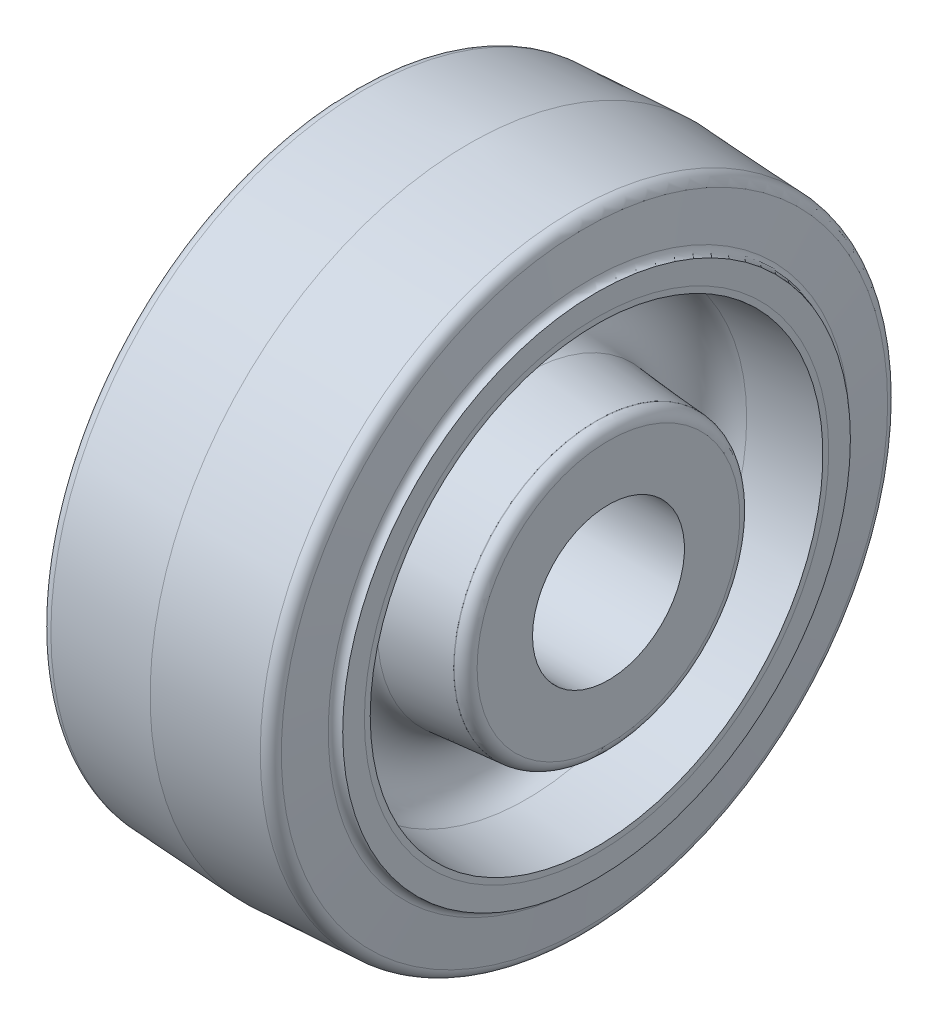
ISO-10303-21;
HEADER;
FILE_DESCRIPTION(('STEP AP214'),'2;1');
FILE_NAME('part.step','',(''),(''),'','','');
FILE_SCHEMA(('AUTOMOTIVE_DESIGN { 1 0 10303 214 1 1 1 1 }'));
ENDSEC;
DATA;
#1=APPLICATION_CONTEXT('core data for automotive mechanical design processes');
#2=APPLICATION_PROTOCOL_DEFINITION('international standard','automotive_design',2000,#1);
#3=PRODUCT_CONTEXT('',#1,'mechanical');
#4=PRODUCT('Part','Part','',(#3));
#5=PRODUCT_RELATED_PRODUCT_CATEGORY('part','',(#4));
#6=PRODUCT_DEFINITION_FORMATION('','',#4);
#7=PRODUCT_DEFINITION_CONTEXT('part definition',#1,'design');
#8=PRODUCT_DEFINITION('design','',#6,#7);
#9=PRODUCT_DEFINITION_SHAPE('','',#8);
#10=(LENGTH_UNIT() NAMED_UNIT(*) SI_UNIT(.MILLI.,.METRE.));
#11=(NAMED_UNIT(*) PLANE_ANGLE_UNIT() SI_UNIT($,.RADIAN.));
#12=(NAMED_UNIT(*) SI_UNIT($,.STERADIAN.) SOLID_ANGLE_UNIT());
#13=UNCERTAINTY_MEASURE_WITH_UNIT(LENGTH_MEASURE(1.E-05),#10,'distance_accuracy_value','');
#14=(GEOMETRIC_REPRESENTATION_CONTEXT(3) GLOBAL_UNCERTAINTY_ASSIGNED_CONTEXT((#13)) GLOBAL_UNIT_ASSIGNED_CONTEXT((#10,
#11,#12)) REPRESENTATION_CONTEXT('',''));
#15=CARTESIAN_POINT('',(0.,0.,0.));
#16=DIRECTION('',(0.,0.,1.));
#17=DIRECTION('',(1.,0.,0.));
#18=AXIS2_PLACEMENT_3D('',#15,#16,#17);
#19=CARTESIAN_POINT('',(-25.4889,0.,0.));
#20=DIRECTION('',(-1.,0.,0.));
#21=DIRECTION('',(0.,0.,1.));
#22=AXIS2_PLACEMENT_3D('',#19,#20,#21);
#23=TOROIDAL_SURFACE('',#22,26.162,2.286);
#24=CARTESIAN_POINT('',(-25.4889,0.,0.));
#25=DIRECTION('',(-1.,0.,0.));
#26=DIRECTION('',(0.,0.,1.));
#27=AXIS2_PLACEMENT_3D('',#24,#25,#26);
#28=CIRCLE('',#27,28.448);
#29=CARTESIAN_POINT('',(-25.4889,0.,28.448));
#30=VERTEX_POINT('',#29);
#31=EDGE_CURVE('E11',#30,#30,#28,.T.);
#32=ORIENTED_EDGE('',*,*,#31,.T.);
#33=EDGE_LOOP('',(#32));
#34=FACE_BOUND('',#33,.T.);
#35=CARTESIAN_POINT('',(-27.7749,0.,0.));
#36=DIRECTION('',(-1.,0.,0.));
#37=DIRECTION('',(0.,0.,1.));
#38=AXIS2_PLACEMENT_3D('',#35,#36,#37);
#39=CIRCLE('',#38,26.162);
#40=CARTESIAN_POINT('',(-27.7749,0.,26.162));
#41=VERTEX_POINT('',#40);
#42=EDGE_CURVE('E106',#41,#41,#39,.T.);
#43=ORIENTED_EDGE('',*,*,#42,.F.);
#44=EDGE_LOOP('',(#43));
#45=FACE_BOUND('',#44,.T.);
#46=ADVANCED_FACE('F36',(#34,#45),#23,.T.);
#47=CARTESIAN_POINT('',(27.7749,0.,0.));
#48=DIRECTION('',(-1.,0.,0.));
#49=DIRECTION('',(0.,0.,1.));
#50=AXIS2_PLACEMENT_3D('',#47,#48,#49);
#51=CYLINDRICAL_SURFACE('',#50,28.448);
#52=CARTESIAN_POINT('',(-25.4,0.,0.));
#53=DIRECTION('',(-1.,0.,0.));
#54=DIRECTION('',(0.,0.,1.));
#55=AXIS2_PLACEMENT_3D('',#52,#53,#54);
#56=CIRCLE('',#55,28.448);
#57=CARTESIAN_POINT('',(-25.4,0.,28.448));
#58=VERTEX_POINT('',#57);
#59=EDGE_CURVE('E42',#58,#58,#56,.T.);
#60=ORIENTED_EDGE('',*,*,#59,.T.);
#61=EDGE_LOOP('',(#60));
#62=FACE_BOUND('',#61,.T.);
#63=ORIENTED_EDGE('',*,*,#31,.F.);
#64=EDGE_LOOP('',(#63));
#65=FACE_BOUND('',#64,.T.);
#66=ADVANCED_FACE('F114',(#62,#65),#51,.T.);
#67=CARTESIAN_POINT('',(-25.4,28.448,0.));
#68=DIRECTION('',(-1.,0.,0.));
#69=DIRECTION('',(0.,0.,1.));
#70=AXIS2_PLACEMENT_3D('',#67,#68,#69);
#71=PLANE('',#70);
#72=CARTESIAN_POINT('',(-25.4,0.,0.));
#73=DIRECTION('',(-1.,0.,0.));
#74=DIRECTION('',(0.,0.,1.));
#75=AXIS2_PLACEMENT_3D('',#72,#73,#74);
#76=CIRCLE('',#75,28.4557777421875);
#77=CARTESIAN_POINT('',(-25.4,0.,28.4557777421875));
#78=VERTEX_POINT('',#77);
#79=EDGE_CURVE('E46',#78,#78,#76,.T.);
#80=ORIENTED_EDGE('',*,*,#79,.T.);
#81=EDGE_LOOP('',(#80));
#82=FACE_BOUND('',#81,.T.);
#83=ORIENTED_EDGE('',*,*,#59,.F.);
#84=EDGE_LOOP('',(#83));
#85=FACE_BOUND('',#84,.T.);
#86=ADVANCED_FACE('F118',(#82,#85),#71,.T.);
#87=CARTESIAN_POINT('',(-25.4,0.,0.));
#88=DIRECTION('',(1.,0.,0.));
#89=DIRECTION('',(0.,0.,-1.));
#90=AXIS2_PLACEMENT_3D('',#87,#88,#89);
#91=CONICAL_SURFACE('',#90,28.4557777421875,0.0872664625997167);
#92=CARTESIAN_POINT('',(-11.4451483575787,0.,0.));
#93=DIRECTION('',(-1.,0.,0.));
#94=DIRECTION('',(0.,0.,1.));
#95=AXIS2_PLACEMENT_3D('',#92,#93,#94);
#96=CIRCLE('',#95,29.6766690620855);
#97=CARTESIAN_POINT('',(-11.4451483575787,0.,29.6766690620855));
#98=VERTEX_POINT('',#97);
#99=EDGE_CURVE('E50',#98,#98,#96,.T.);
#100=ORIENTED_EDGE('',*,*,#99,.T.);
#101=EDGE_LOOP('',(#100));
#102=FACE_BOUND('',#101,.T.);
#103=ORIENTED_EDGE('',*,*,#79,.F.);
#104=EDGE_LOOP('',(#103));
#105=FACE_BOUND('',#104,.T.);
#106=ADVANCED_FACE('F122',(#102,#105),#91,.T.);
#107=CARTESIAN_POINT('',(-12.065,0.,0.));
#108=DIRECTION('',(-1.,0.,0.));
#109=DIRECTION('',(0.,0.,1.));
#110=AXIS2_PLACEMENT_3D('',#107,#108,#109);
#111=TOROIDAL_SURFACE('',#110,36.7616057549139,7.112);
#112=CARTESIAN_POINT('',(-11.4451483575787,0.,0.));
#113=DIRECTION('',(-1.,0.,0.));
#114=DIRECTION('',(0.,0.,1.));
#115=AXIS2_PLACEMENT_3D('',#112,#113,#114);
#116=CIRCLE('',#115,43.8465424477424);
#117=CARTESIAN_POINT('',(-11.4451483575787,0.,43.8465424477424));
#118=VERTEX_POINT('',#117);
#119=EDGE_CURVE('E55',#118,#118,#116,.T.);
#120=ORIENTED_EDGE('',*,*,#119,.T.);
#121=EDGE_LOOP('',(#120));
#122=FACE_BOUND('',#121,.T.);
#123=ORIENTED_EDGE('',*,*,#99,.F.);
#124=EDGE_LOOP('',(#123));
#125=FACE_BOUND('',#124,.T.);
#126=ADVANCED_FACE('F129',(#122,#125),#111,.F.);
#127=CARTESIAN_POINT('',(-11.4451483575787,0.,0.));
#128=DIRECTION('',(-1.,0.,0.));
#129=DIRECTION('',(0.,0.,1.));
#130=AXIS2_PLACEMENT_3D('',#127,#128,#129);
#131=CONICAL_SURFACE('',#130,43.8465424477424,0.0872664625997172);
#132=CARTESIAN_POINT('',(-25.4,0.,0.));
#133=DIRECTION('',(-1.,0.,0.));
#134=DIRECTION('',(0.,0.,1.));
#135=AXIS2_PLACEMENT_3D('',#132,#133,#134);
#136=CIRCLE('',#135,45.0674337676404);
#137=CARTESIAN_POINT('',(-25.4,0.,45.0674337676404));
#138=VERTEX_POINT('',#137);
#139=EDGE_CURVE('E58',#138,#138,#136,.T.);
#140=ORIENTED_EDGE('',*,*,#139,.T.);
#141=EDGE_LOOP('',(#140));
#142=FACE_BOUND('',#141,.T.);
#143=ORIENTED_EDGE('',*,*,#119,.F.);
#144=EDGE_LOOP('',(#143));
#145=FACE_BOUND('',#144,.T.);
#146=ADVANCED_FACE('F133',(#142,#145),#131,.F.);
#147=CARTESIAN_POINT('',(-25.4,45.0674337676404,0.));
#148=DIRECTION('',(-1.,0.,0.));
#149=DIRECTION('',(0.,0.,1.));
#150=AXIS2_PLACEMENT_3D('',#147,#148,#149);
#151=PLANE('',#150);
#152=CARTESIAN_POINT('',(-25.4,0.,0.));
#153=DIRECTION('',(-1.,0.,0.));
#154=DIRECTION('',(0.,0.,1.));
#155=AXIS2_PLACEMENT_3D('',#152,#153,#154);
#156=CIRCLE('',#155,46.228);
#157=CARTESIAN_POINT('',(-25.4,0.,46.228));
#158=VERTEX_POINT('',#157);
#159=EDGE_CURVE('E61',#158,#158,#156,.T.);
#160=ORIENTED_EDGE('',*,*,#159,.T.);
#161=EDGE_LOOP('',(#160));
#162=FACE_BOUND('',#161,.T.);
#163=ORIENTED_EDGE('',*,*,#139,.F.);
#164=EDGE_LOOP('',(#163));
#165=FACE_BOUND('',#164,.T.);
#166=ADVANCED_FACE('F137',(#162,#165),#151,.T.);
#167=CARTESIAN_POINT('',(27.7749,0.,0.));
#168=DIRECTION('',(-1.,0.,0.));
#169=DIRECTION('',(0.,0.,1.));
#170=AXIS2_PLACEMENT_3D('',#167,#168,#169);
#171=CYLINDRICAL_SURFACE('',#170,46.228);
#172=CARTESIAN_POINT('',(-19.05,0.,0.));
#173=DIRECTION('',(-1.,0.,0.));
#174=DIRECTION('',(0.,0.,1.));
#175=AXIS2_PLACEMENT_3D('',#172,#173,#174);
#176=CIRCLE('',#175,46.228);
#177=CARTESIAN_POINT('',(-19.05,0.,46.228));
#178=VERTEX_POINT('',#177);
#179=EDGE_CURVE('E64',#178,#178,#176,.T.);
#180=ORIENTED_EDGE('',*,*,#179,.T.);
#181=EDGE_LOOP('',(#180));
#182=FACE_BOUND('',#181,.T.);
#183=ORIENTED_EDGE('',*,*,#159,.F.);
#184=EDGE_LOOP('',(#183));
#185=FACE_BOUND('',#184,.T.);
#186=ADVANCED_FACE('F141',(#182,#185),#171,.T.);
#187=CARTESIAN_POINT('',(-19.05,46.228,0.));
#188=DIRECTION('',(-1.,0.,0.));
#189=DIRECTION('',(0.,0.,1.));
#190=AXIS2_PLACEMENT_3D('',#187,#188,#189);
#191=PLANE('',#190);
#192=CARTESIAN_POINT('',(-19.05,0.,0.));
#193=DIRECTION('',(-1.,0.,0.));
#194=DIRECTION('',(0.,0.,1.));
#195=AXIS2_PLACEMENT_3D('',#192,#193,#194);
#196=CIRCLE('',#195,53.848);
#197=CARTESIAN_POINT('',(-19.05,0.,53.848));
#198=VERTEX_POINT('',#197);
#199=EDGE_CURVE('E67',#198,#198,#196,.T.);
#200=ORIENTED_EDGE('',*,*,#199,.T.);
#201=EDGE_LOOP('',(#200));
#202=FACE_BOUND('',#201,.T.);
#203=ORIENTED_EDGE('',*,*,#179,.F.);
#204=EDGE_LOOP('',(#203));
#205=FACE_BOUND('',#204,.T.);
#206=ADVANCED_FACE('F145',(#202,#205),#191,.T.);
#207=CARTESIAN_POINT('',(27.7749,0.,0.));
#208=DIRECTION('',(-1.,0.,0.));
#209=DIRECTION('',(0.,0.,1.));
#210=AXIS2_PLACEMENT_3D('',#207,#208,#209);
#211=CYLINDRICAL_SURFACE('',#210,53.848);
#212=CARTESIAN_POINT('',(19.05,0.,0.));
#213=DIRECTION('',(-1.,0.,0.));
#214=DIRECTION('',(0.,0.,1.));
#215=AXIS2_PLACEMENT_3D('',#212,#213,#214);
#216=CIRCLE('',#215,53.848);
#217=CARTESIAN_POINT('',(19.05,0.,53.848));
#218=VERTEX_POINT('',#217);
#219=EDGE_CURVE('E70',#218,#218,#216,.T.);
#220=ORIENTED_EDGE('',*,*,#219,.T.);
#221=EDGE_LOOP('',(#220));
#222=FACE_BOUND('',#221,.T.);
#223=ORIENTED_EDGE('',*,*,#199,.F.);
#224=EDGE_LOOP('',(#223));
#225=FACE_BOUND('',#224,.T.);
#226=ADVANCED_FACE('F149',(#222,#225),#211,.T.);
#227=CARTESIAN_POINT('',(19.05,53.848,0.));
#228=DIRECTION('',(1.,0.,0.));
#229=DIRECTION('',(0.,0.,-1.));
#230=AXIS2_PLACEMENT_3D('',#227,#228,#229);
#231=PLANE('',#230);
#232=CARTESIAN_POINT('',(19.05,0.,0.));
#233=DIRECTION('',(-1.,0.,0.));
#234=DIRECTION('',(0.,0.,1.));
#235=AXIS2_PLACEMENT_3D('',#232,#233,#234);
#236=CIRCLE('',#235,46.228);
#237=CARTESIAN_POINT('',(19.05,0.,46.228));
#238=VERTEX_POINT('',#237);
#239=EDGE_CURVE('E73',#238,#238,#236,.T.);
#240=ORIENTED_EDGE('',*,*,#239,.T.);
#241=EDGE_LOOP('',(#240));
#242=FACE_BOUND('',#241,.T.);
#243=ORIENTED_EDGE('',*,*,#219,.F.);
#244=EDGE_LOOP('',(#243));
#245=FACE_BOUND('',#244,.T.);
#246=ADVANCED_FACE('F153',(#242,#245),#231,.T.);
#247=CARTESIAN_POINT('',(27.7749,0.,0.));
#248=DIRECTION('',(-1.,0.,0.));
#249=DIRECTION('',(0.,0.,1.));
#250=AXIS2_PLACEMENT_3D('',#247,#248,#249);
#251=CYLINDRICAL_SURFACE('',#250,46.228);
#252=CARTESIAN_POINT('',(25.4,0.,0.));
#253=DIRECTION('',(-1.,0.,0.));
#254=DIRECTION('',(0.,0.,1.));
#255=AXIS2_PLACEMENT_3D('',#252,#253,#254);
#256=CIRCLE('',#255,46.228);
#257=CARTESIAN_POINT('',(25.4,0.,46.228));
#258=VERTEX_POINT('',#257);
#259=EDGE_CURVE('E76',#258,#258,#256,.T.);
#260=ORIENTED_EDGE('',*,*,#259,.T.);
#261=EDGE_LOOP('',(#260));
#262=FACE_BOUND('',#261,.T.);
#263=ORIENTED_EDGE('',*,*,#239,.F.);
#264=EDGE_LOOP('',(#263));
#265=FACE_BOUND('',#264,.T.);
#266=ADVANCED_FACE('F157',(#262,#265),#251,.T.);
#267=CARTESIAN_POINT('',(25.4,46.228,0.));
#268=DIRECTION('',(1.,0.,0.));
#269=DIRECTION('',(0.,0.,-1.));
#270=AXIS2_PLACEMENT_3D('',#267,#268,#269);
#271=PLANE('',#270);
#272=CARTESIAN_POINT('',(25.4,0.,0.));
#273=DIRECTION('',(-1.,0.,0.));
#274=DIRECTION('',(0.,0.,1.));
#275=AXIS2_PLACEMENT_3D('',#272,#273,#274);
#276=CIRCLE('',#275,45.0674337676404);
#277=CARTESIAN_POINT('',(25.4,0.,45.0674337676404));
#278=VERTEX_POINT('',#277);
#279=EDGE_CURVE('E79',#278,#278,#276,.T.);
#280=ORIENTED_EDGE('',*,*,#279,.T.);
#281=EDGE_LOOP('',(#280));
#282=FACE_BOUND('',#281,.T.);
#283=ORIENTED_EDGE('',*,*,#259,.F.);
#284=EDGE_LOOP('',(#283));
#285=FACE_BOUND('',#284,.T.);
#286=ADVANCED_FACE('F161',(#282,#285),#271,.T.);
#287=CARTESIAN_POINT('',(25.4,0.,0.));
#288=DIRECTION('',(1.,0.,0.));
#289=DIRECTION('',(0.,0.,-1.));
#290=AXIS2_PLACEMENT_3D('',#287,#288,#289);
#291=CONICAL_SURFACE('',#290,45.0674337676404,0.0872664625997172);
#292=CARTESIAN_POINT('',(11.4451483575787,0.,0.));
#293=DIRECTION('',(-1.,0.,0.));
#294=DIRECTION('',(0.,0.,1.));
#295=AXIS2_PLACEMENT_3D('',#292,#293,#294);
#296=CIRCLE('',#295,43.8465424477424);
#297=CARTESIAN_POINT('',(11.4451483575787,0.,43.8465424477424));
#298=VERTEX_POINT('',#297);
#299=EDGE_CURVE('E82',#298,#298,#296,.T.);
#300=ORIENTED_EDGE('',*,*,#299,.T.);
#301=EDGE_LOOP('',(#300));
#302=FACE_BOUND('',#301,.T.);
#303=ORIENTED_EDGE('',*,*,#279,.F.);
#304=EDGE_LOOP('',(#303));
#305=FACE_BOUND('',#304,.T.);
#306=ADVANCED_FACE('F165',(#302,#305),#291,.F.);
#307=CARTESIAN_POINT('',(12.065,0.,0.));
#308=DIRECTION('',(-1.,0.,0.));
#309=DIRECTION('',(0.,0.,1.));
#310=AXIS2_PLACEMENT_3D('',#307,#308,#309);
#311=TOROIDAL_SURFACE('',#310,36.7616057549139,7.112);
#312=CARTESIAN_POINT('',(11.4451483575787,0.,0.));
#313=DIRECTION('',(-1.,0.,0.));
#314=DIRECTION('',(0.,0.,1.));
#315=AXIS2_PLACEMENT_3D('',#312,#313,#314);
#316=CIRCLE('',#315,29.6766690620855);
#317=CARTESIAN_POINT('',(11.4451483575787,0.,29.6766690620855));
#318=VERTEX_POINT('',#317);
#319=EDGE_CURVE('E85',#318,#318,#316,.T.);
#320=ORIENTED_EDGE('',*,*,#319,.T.);
#321=EDGE_LOOP('',(#320));
#322=FACE_BOUND('',#321,.T.);
#323=ORIENTED_EDGE('',*,*,#299,.F.);
#324=EDGE_LOOP('',(#323));
#325=FACE_BOUND('',#324,.T.);
#326=ADVANCED_FACE('F169',(#322,#325),#311,.F.);
#327=CARTESIAN_POINT('',(11.4451483575787,0.,0.));
#328=DIRECTION('',(-1.,0.,0.));
#329=DIRECTION('',(0.,0.,1.));
#330=AXIS2_PLACEMENT_3D('',#327,#328,#329);
#331=CONICAL_SURFACE('',#330,29.6766690620855,0.0872664625997167);
#332=CARTESIAN_POINT('',(25.4,0.,0.));
#333=DIRECTION('',(-1.,0.,0.));
#334=DIRECTION('',(0.,0.,1.));
#335=AXIS2_PLACEMENT_3D('',#332,#333,#334);
#336=CIRCLE('',#335,28.4557777421875);
#337=CARTESIAN_POINT('',(25.4,0.,28.4557777421875));
#338=VERTEX_POINT('',#337);
#339=EDGE_CURVE('E88',#338,#338,#336,.T.);
#340=ORIENTED_EDGE('',*,*,#339,.T.);
#341=EDGE_LOOP('',(#340));
#342=FACE_BOUND('',#341,.T.);
#343=ORIENTED_EDGE('',*,*,#319,.F.);
#344=EDGE_LOOP('',(#343));
#345=FACE_BOUND('',#344,.T.);
#346=ADVANCED_FACE('F173',(#342,#345),#331,.T.);
#347=CARTESIAN_POINT('',(25.4,28.4557777421875,0.));
#348=DIRECTION('',(1.,0.,0.));
#349=DIRECTION('',(0.,0.,-1.));
#350=AXIS2_PLACEMENT_3D('',#347,#348,#349);
#351=PLANE('',#350);
#352=CARTESIAN_POINT('',(25.4,0.,0.));
#353=DIRECTION('',(-1.,0.,0.));
#354=DIRECTION('',(0.,0.,1.));
#355=AXIS2_PLACEMENT_3D('',#352,#353,#354);
#356=CIRCLE('',#355,28.448);
#357=CARTESIAN_POINT('',(25.4,0.,28.448));
#358=VERTEX_POINT('',#357);
#359=EDGE_CURVE('E91',#358,#358,#356,.T.);
#360=ORIENTED_EDGE('',*,*,#359,.T.);
#361=EDGE_LOOP('',(#360));
#362=FACE_BOUND('',#361,.T.);
#363=ORIENTED_EDGE('',*,*,#339,.F.);
#364=EDGE_LOOP('',(#363));
#365=FACE_BOUND('',#364,.T.);
#366=ADVANCED_FACE('F177',(#362,#365),#351,.T.);
#367=CARTESIAN_POINT('',(27.7749,0.,0.));
#368=DIRECTION('',(-1.,0.,0.));
#369=DIRECTION('',(0.,0.,1.));
#370=AXIS2_PLACEMENT_3D('',#367,#368,#369);
#371=CYLINDRICAL_SURFACE('',#370,28.448);
#372=CARTESIAN_POINT('',(25.4889,0.,0.));
#373=DIRECTION('',(-1.,0.,0.));
#374=DIRECTION('',(0.,0.,1.));
#375=AXIS2_PLACEMENT_3D('',#372,#373,#374);
#376=CIRCLE('',#375,28.448);
#377=CARTESIAN_POINT('',(25.4889,0.,28.448));
#378=VERTEX_POINT('',#377);
#379=EDGE_CURVE('E94',#378,#378,#376,.T.);
#380=ORIENTED_EDGE('',*,*,#379,.T.);
#381=EDGE_LOOP('',(#380));
#382=FACE_BOUND('',#381,.T.);
#383=ORIENTED_EDGE('',*,*,#359,.F.);
#384=EDGE_LOOP('',(#383));
#385=FACE_BOUND('',#384,.T.);
#386=ADVANCED_FACE('F181',(#382,#385),#371,.T.);
#387=CARTESIAN_POINT('',(25.4889,0.,0.));
#388=DIRECTION('',(-1.,0.,0.));
#389=DIRECTION('',(0.,0.,1.));
#390=AXIS2_PLACEMENT_3D('',#387,#388,#389);
#391=TOROIDAL_SURFACE('',#390,26.162,2.286);
#392=CARTESIAN_POINT('',(27.7749,0.,0.));
#393=DIRECTION('',(-1.,0.,0.));
#394=DIRECTION('',(0.,0.,1.));
#395=AXIS2_PLACEMENT_3D('',#392,#393,#394);
#396=CIRCLE('',#395,26.162);
#397=CARTESIAN_POINT('',(27.7749,0.,26.162));
#398=VERTEX_POINT('',#397);
#399=EDGE_CURVE('E97',#398,#398,#396,.T.);
#400=ORIENTED_EDGE('',*,*,#399,.T.);
#401=EDGE_LOOP('',(#400));
#402=FACE_BOUND('',#401,.T.);
#403=ORIENTED_EDGE('',*,*,#379,.F.);
#404=EDGE_LOOP('',(#403));
#405=FACE_BOUND('',#404,.T.);
#406=ADVANCED_FACE('F185',(#402,#405),#391,.T.);
#407=CARTESIAN_POINT('',(27.7749,26.162,0.));
#408=DIRECTION('',(1.,0.,0.));
#409=DIRECTION('',(0.,0.,-1.));
#410=AXIS2_PLACEMENT_3D('',#407,#408,#409);
#411=PLANE('',#410);
#412=CARTESIAN_POINT('',(27.7749,0.,0.));
#413=DIRECTION('',(-1.,0.,0.));
#414=DIRECTION('',(0.,0.,1.));
#415=AXIS2_PLACEMENT_3D('',#412,#413,#414);
#416=CIRCLE('',#415,15.1257);
#417=CARTESIAN_POINT('',(27.7749,0.,15.1257));
#418=VERTEX_POINT('',#417);
#419=EDGE_CURVE('E100',#418,#418,#416,.T.);
#420=ORIENTED_EDGE('',*,*,#419,.T.);
#421=EDGE_LOOP('',(#420));
#422=FACE_BOUND('',#421,.T.);
#423=ORIENTED_EDGE('',*,*,#399,.F.);
#424=EDGE_LOOP('',(#423));
#425=FACE_BOUND('',#424,.T.);
#426=ADVANCED_FACE('F189',(#422,#425),#411,.T.);
#427=CARTESIAN_POINT('',(27.7749,0.,0.));
#428=DIRECTION('',(-1.,0.,0.));
#429=DIRECTION('',(0.,0.,1.));
#430=AXIS2_PLACEMENT_3D('',#427,#428,#429);
#431=CYLINDRICAL_SURFACE('',#430,15.1257);
#432=CARTESIAN_POINT('',(-27.7749,0.,0.));
#433=DIRECTION('',(-1.,0.,0.));
#434=DIRECTION('',(0.,0.,1.));
#435=AXIS2_PLACEMENT_3D('',#432,#433,#434);
#436=CIRCLE('',#435,15.1257);
#437=CARTESIAN_POINT('',(-27.7749,0.,15.1257));
#438=VERTEX_POINT('',#437);
#439=EDGE_CURVE('E103',#438,#438,#436,.T.);
#440=ORIENTED_EDGE('',*,*,#439,.T.);
#441=EDGE_LOOP('',(#440));
#442=FACE_BOUND('',#441,.T.);
#443=ORIENTED_EDGE('',*,*,#419,.F.);
#444=EDGE_LOOP('',(#443));
#445=FACE_BOUND('',#444,.T.);
#446=ADVANCED_FACE('F193',(#442,#445),#431,.F.);
#447=CARTESIAN_POINT('',(-27.7749,15.1257,0.));
#448=DIRECTION('',(-1.,0.,0.));
#449=DIRECTION('',(0.,0.,1.));
#450=AXIS2_PLACEMENT_3D('',#447,#448,#449);
#451=PLANE('',#450);
#452=ORIENTED_EDGE('',*,*,#42,.T.);
#453=EDGE_LOOP('',(#452));
#454=FACE_BOUND('',#453,.T.);
#455=ORIENTED_EDGE('',*,*,#439,.F.);
#456=EDGE_LOOP('',(#455));
#457=FACE_BOUND('',#456,.T.);
#458=ADVANCED_FACE('F110',(#454,#457),#451,.T.);
#459=CLOSED_SHELL('',(#46,#66,#86,#106,#126,#146,#166,#186,#206,#226,#246,#266,#286,#306,#326,
#346,#366,#386,#406,#426,#446,#458));
#460=MANIFOLD_SOLID_BREP('B2',#459);
#461=CARTESIAN_POINT('',(25.4,0.,0.));
#462=DIRECTION('',(1.,0.,0.));
#463=DIRECTION('',(0.,0.,-1.));
#464=AXIS2_PLACEMENT_3D('',#461,#462,#463);
#465=TOROIDAL_SURFACE('',#464,52.07,1.524);
#466=CARTESIAN_POINT('',(23.8843486314587,0.,0.));
#467=DIRECTION('',(1.,0.,0.));
#468=DIRECTION('',(0.,0.,-1.));
#469=AXIS2_PLACEMENT_3D('',#466,#467,#468);
#470=CIRCLE('',#469,51.9106986219801);
#471=CARTESIAN_POINT('',(23.8843486314587,0.,-51.9106986219801));
#472=VERTEX_POINT('',#471);
#473=EDGE_CURVE('E416',#472,#472,#470,.T.);
#474=ORIENTED_EDGE('',*,*,#473,.T.);
#475=EDGE_LOOP('',(#474));
#476=FACE_BOUND('',#475,.T.);
#477=CARTESIAN_POINT('',(25.4,0.,0.));
#478=DIRECTION('',(1.,0.,0.));
#479=DIRECTION('',(0.,0.,-1.));
#480=AXIS2_PLACEMENT_3D('',#477,#478,#479);
#481=CIRCLE('',#480,50.546);
#482=CARTESIAN_POINT('',(25.4,0.,-50.546));
#483=VERTEX_POINT('',#482);
#484=EDGE_CURVE('E35',#483,#483,#481,.T.);
#485=ORIENTED_EDGE('',*,*,#484,.F.);
#486=EDGE_LOOP('',(#485));
#487=FACE_BOUND('',#486,.T.);
#488=ADVANCED_FACE('F367',(#476,#487),#465,.F.);
#489=CARTESIAN_POINT('',(25.4,46.228,0.));
#490=DIRECTION('',(1.,0.,0.));
#491=DIRECTION('',(0.,0.,-1.));
#492=AXIS2_PLACEMENT_3D('',#489,#490,#491);
#493=PLANE('',#492);
#494=ORIENTED_EDGE('',*,*,#484,.T.);
#495=EDGE_LOOP('',(#494));
#496=FACE_BOUND('',#495,.T.);
#497=CARTESIAN_POINT('',(25.4,0.,0.));
#498=DIRECTION('',(1.,0.,0.));
#499=DIRECTION('',(0.,0.,-1.));
#500=AXIS2_PLACEMENT_3D('',#497,#498,#499);
#501=CIRCLE('',#500,46.228);
#502=CARTESIAN_POINT('',(25.4,0.,-46.228));
#503=VERTEX_POINT('',#502);
#504=EDGE_CURVE('E373',#503,#503,#501,.T.);
#505=ORIENTED_EDGE('',*,*,#504,.F.);
#506=EDGE_LOOP('',(#505));
#507=FACE_BOUND('',#506,.T.);
#508=ADVANCED_FACE('F434',(#496,#507),#493,.T.);
#509=CARTESIAN_POINT('',(-25.4,0.,0.));
#510=DIRECTION('',(1.,0.,0.));
#511=DIRECTION('',(0.,0.,-1.));
#512=AXIS2_PLACEMENT_3D('',#509,#510,#511);
#513=CYLINDRICAL_SURFACE('',#512,46.228);
#514=ORIENTED_EDGE('',*,*,#504,.T.);
#515=EDGE_LOOP('',(#514));
#516=FACE_BOUND('',#515,.T.);
#517=CARTESIAN_POINT('',(19.05,0.,0.));
#518=DIRECTION('',(1.,0.,0.));
#519=DIRECTION('',(0.,0.,-1.));
#520=AXIS2_PLACEMENT_3D('',#517,#518,#519);
#521=CIRCLE('',#520,46.228);
#522=CARTESIAN_POINT('',(19.05,0.,-46.228));
#523=VERTEX_POINT('',#522);
#524=EDGE_CURVE('E377',#523,#523,#521,.T.);
#525=ORIENTED_EDGE('',*,*,#524,.F.);
#526=EDGE_LOOP('',(#525));
#527=FACE_BOUND('',#526,.T.);
#528=ADVANCED_FACE('F438',(#516,#527),#513,.F.);
#529=CARTESIAN_POINT('',(19.05,53.848,0.));
#530=DIRECTION('',(-1.,0.,0.));
#531=DIRECTION('',(0.,0.,1.));
#532=AXIS2_PLACEMENT_3D('',#529,#530,#531);
#533=PLANE('',#532);
#534=ORIENTED_EDGE('',*,*,#524,.T.);
#535=EDGE_LOOP('',(#534));
#536=FACE_BOUND('',#535,.T.);
#537=CARTESIAN_POINT('',(19.05,0.,0.));
#538=DIRECTION('',(1.,0.,0.));
#539=DIRECTION('',(0.,0.,-1.));
#540=AXIS2_PLACEMENT_3D('',#537,#538,#539);
#541=CIRCLE('',#540,53.848);
#542=CARTESIAN_POINT('',(19.05,0.,-53.848));
#543=VERTEX_POINT('',#542);
#544=EDGE_CURVE('E381',#543,#543,#541,.T.);
#545=ORIENTED_EDGE('',*,*,#544,.F.);
#546=EDGE_LOOP('',(#545));
#547=FACE_BOUND('',#546,.T.);
#548=ADVANCED_FACE('F442',(#536,#547),#533,.T.);
#549=CARTESIAN_POINT('',(-25.4,0.,0.));
#550=DIRECTION('',(1.,0.,0.));
#551=DIRECTION('',(0.,0.,-1.));
#552=AXIS2_PLACEMENT_3D('',#549,#550,#551);
#553=CYLINDRICAL_SURFACE('',#552,53.848);
#554=ORIENTED_EDGE('',*,*,#544,.T.);
#555=EDGE_LOOP('',(#554));
#556=FACE_BOUND('',#555,.T.);
#557=CARTESIAN_POINT('',(-19.05,0.,0.));
#558=DIRECTION('',(1.,0.,0.));
#559=DIRECTION('',(0.,0.,-1.));
#560=AXIS2_PLACEMENT_3D('',#557,#558,#559);
#561=CIRCLE('',#560,53.848);
#562=CARTESIAN_POINT('',(-19.05,0.,-53.848));
#563=VERTEX_POINT('',#562);
#564=EDGE_CURVE('E386',#563,#563,#561,.T.);
#565=ORIENTED_EDGE('',*,*,#564,.F.);
#566=EDGE_LOOP('',(#565));
#567=FACE_BOUND('',#566,.T.);
#568=ADVANCED_FACE('F448',(#556,#567),#553,.F.);
#569=CARTESIAN_POINT('',(-19.05,46.228,0.));
#570=DIRECTION('',(1.,0.,0.));
#571=DIRECTION('',(0.,0.,-1.));
#572=AXIS2_PLACEMENT_3D('',#569,#570,#571);
#573=PLANE('',#572);
#574=ORIENTED_EDGE('',*,*,#564,.T.);
#575=EDGE_LOOP('',(#574));
#576=FACE_BOUND('',#575,.T.);
#577=CARTESIAN_POINT('',(-19.05,0.,0.));
#578=DIRECTION('',(1.,0.,0.));
#579=DIRECTION('',(0.,0.,-1.));
#580=AXIS2_PLACEMENT_3D('',#577,#578,#579);
#581=CIRCLE('',#580,46.228);
#582=CARTESIAN_POINT('',(-19.05,0.,-46.228));
#583=VERTEX_POINT('',#582);
#584=EDGE_CURVE('E389',#583,#583,#581,.T.);
#585=ORIENTED_EDGE('',*,*,#584,.F.);
#586=EDGE_LOOP('',(#585));
#587=FACE_BOUND('',#586,.T.);
#588=ADVANCED_FACE('F452',(#576,#587),#573,.T.);
#589=CARTESIAN_POINT('',(-25.4,0.,0.));
#590=DIRECTION('',(1.,0.,0.));
#591=DIRECTION('',(0.,0.,-1.));
#592=AXIS2_PLACEMENT_3D('',#589,#590,#591);
#593=CYLINDRICAL_SURFACE('',#592,46.228);
#594=ORIENTED_EDGE('',*,*,#584,.T.);
#595=EDGE_LOOP('',(#594));
#596=FACE_BOUND('',#595,.T.);
#597=CARTESIAN_POINT('',(-25.4,0.,0.));
#598=DIRECTION('',(1.,0.,0.));
#599=DIRECTION('',(0.,0.,-1.));
#600=AXIS2_PLACEMENT_3D('',#597,#598,#599);
#601=CIRCLE('',#600,46.228);
#602=CARTESIAN_POINT('',(-25.4,0.,-46.228));
#603=VERTEX_POINT('',#602);
#604=EDGE_CURVE('E392',#603,#603,#601,.T.);
#605=ORIENTED_EDGE('',*,*,#604,.F.);
#606=EDGE_LOOP('',(#605));
#607=FACE_BOUND('',#606,.T.);
#608=ADVANCED_FACE('F456',(#596,#607),#593,.F.);
#609=CARTESIAN_POINT('',(-25.4,50.546,0.));
#610=DIRECTION('',(-1.,0.,0.));
#611=DIRECTION('',(0.,0.,1.));
#612=AXIS2_PLACEMENT_3D('',#609,#610,#611);
#613=PLANE('',#612);
#614=ORIENTED_EDGE('',*,*,#604,.T.);
#615=EDGE_LOOP('',(#614));
#616=FACE_BOUND('',#615,.T.);
#617=CARTESIAN_POINT('',(-25.4,0.,0.));
#618=DIRECTION('',(1.,0.,0.));
#619=DIRECTION('',(0.,0.,-1.));
#620=AXIS2_PLACEMENT_3D('',#617,#618,#619);
#621=CIRCLE('',#620,50.546);
#622=CARTESIAN_POINT('',(-25.4,0.,-50.546));
#623=VERTEX_POINT('',#622);
#624=EDGE_CURVE('E395',#623,#623,#621,.T.);
#625=ORIENTED_EDGE('',*,*,#624,.F.);
#626=EDGE_LOOP('',(#625));
#627=FACE_BOUND('',#626,.T.);
#628=ADVANCED_FACE('F460',(#616,#627),#613,.T.);
#629=CARTESIAN_POINT('',(-25.4,0.,0.));
#630=DIRECTION('',(1.,0.,0.));
#631=DIRECTION('',(0.,0.,-1.));
#632=AXIS2_PLACEMENT_3D('',#629,#630,#631);
#633=TOROIDAL_SURFACE('',#632,52.07,1.524);
#634=ORIENTED_EDGE('',*,*,#624,.T.);
#635=EDGE_LOOP('',(#634));
#636=FACE_BOUND('',#635,.T.);
#637=CARTESIAN_POINT('',(-23.8843486314587,0.,0.));
#638=DIRECTION('',(1.,0.,0.));
#639=DIRECTION('',(0.,0.,-1.));
#640=AXIS2_PLACEMENT_3D('',#637,#638,#639);
#641=CIRCLE('',#640,51.9106986219801);
#642=CARTESIAN_POINT('',(-23.8843486314587,0.,-51.9106986219801));
#643=VERTEX_POINT('',#642);
#644=EDGE_CURVE('E398',#643,#643,#641,.T.);
#645=ORIENTED_EDGE('',*,*,#644,.F.);
#646=EDGE_LOOP('',(#645));
#647=FACE_BOUND('',#646,.T.);
#648=ADVANCED_FACE('F464',(#636,#647),#633,.F.);
#649=CARTESIAN_POINT('',(-22.9958919661946,0.,0.));
#650=DIRECTION('',(1.,0.,0.));
#651=DIRECTION('',(0.,0.,-1.));
#652=AXIS2_PLACEMENT_3D('',#649,#650,#651);
#653=CONICAL_SURFACE('',#652,60.3637991370866,1.46607657167524);
#654=ORIENTED_EDGE('',*,*,#644,.T.);
#655=EDGE_LOOP('',(#654));
#656=FACE_BOUND('',#655,.T.);
#657=CARTESIAN_POINT('',(-22.9958919661946,0.,0.));
#658=DIRECTION('',(1.,0.,0.));
#659=DIRECTION('',(0.,0.,-1.));
#660=AXIS2_PLACEMENT_3D('',#657,#658,#659);
#661=CIRCLE('',#660,60.3637991370866);
#662=CARTESIAN_POINT('',(-22.9958919661946,0.,-60.3637991370866));
#663=VERTEX_POINT('',#662);
#664=EDGE_CURVE('E401',#663,#663,#661,.T.);
#665=ORIENTED_EDGE('',*,*,#664,.F.);
#666=EDGE_LOOP('',(#665));
#667=FACE_BOUND('',#666,.T.);
#668=ADVANCED_FACE('F468',(#656,#667),#653,.T.);
#669=CARTESIAN_POINT('',(-20.7224149133828,0.,0.));
#670=DIRECTION('',(1.,0.,0.));
#671=DIRECTION('',(0.,0.,-1.));
#672=AXIS2_PLACEMENT_3D('',#669,#670,#671);
#673=TOROIDAL_SURFACE('',#672,60.1248470700567,2.286);
#674=ORIENTED_EDGE('',*,*,#664,.T.);
#675=EDGE_LOOP('',(#674));
#676=FACE_BOUND('',#675,.T.);
#677=CARTESIAN_POINT('',(-20.8420549093541,0.,0.));
#678=DIRECTION('',(1.,0.,0.));
#679=DIRECTION('',(0.,0.,-1.));
#680=AXIS2_PLACEMENT_3D('',#677,#678,#679);
#681=CIRCLE('',#680,62.4077141865057);
#682=CARTESIAN_POINT('',(-20.8420549093541,0.,-62.4077141865057));
#683=VERTEX_POINT('',#682);
#684=EDGE_CURVE('E404',#683,#683,#681,.T.);
#685=ORIENTED_EDGE('',*,*,#684,.F.);
#686=EDGE_LOOP('',(#685));
#687=FACE_BOUND('',#686,.T.);
#688=ADVANCED_FACE('F472',(#676,#687),#673,.T.);
#689=CARTESIAN_POINT('',(-2.22044604925031E-13,0.,0.));
#690=DIRECTION('',(1.,0.,0.));
#691=DIRECTION('',(0.,0.,-1.));
#692=AXIS2_PLACEMENT_3D('',#689,#690,#691);
#693=CONICAL_SURFACE('',#692,63.5,0.0523598775598225);
#694=ORIENTED_EDGE('',*,*,#684,.T.);
#695=EDGE_LOOP('',(#694));
#696=FACE_BOUND('',#695,.T.);
#697=CARTESIAN_POINT('',(-2.22044604925031E-13,0.,0.));
#698=DIRECTION('',(1.,0.,0.));
#699=DIRECTION('',(0.,0.,-1.));
#700=AXIS2_PLACEMENT_3D('',#697,#698,#699);
#701=CIRCLE('',#700,63.5);
#702=CARTESIAN_POINT('',(-2.22044604925031E-13,0.,-63.5));
#703=VERTEX_POINT('',#702);
#704=EDGE_CURVE('E407',#703,#703,#701,.T.);
#705=ORIENTED_EDGE('',*,*,#704,.F.);
#706=EDGE_LOOP('',(#705));
#707=FACE_BOUND('',#706,.T.);
#708=ADVANCED_FACE('F476',(#696,#707),#693,.T.);
#709=CARTESIAN_POINT('',(20.8420549093542,0.,0.));
#710=DIRECTION('',(-1.,0.,0.));
#711=DIRECTION('',(0.,0.,1.));
#712=AXIS2_PLACEMENT_3D('',#709,#710,#711);
#713=CONICAL_SURFACE('',#712,62.4077141865057,0.0523598775598212);
#714=ORIENTED_EDGE('',*,*,#704,.T.);
#715=EDGE_LOOP('',(#714));
#716=FACE_BOUND('',#715,.T.);
#717=CARTESIAN_POINT('',(20.8420549093542,0.,0.));
#718=DIRECTION('',(1.,0.,0.));
#719=DIRECTION('',(0.,0.,-1.));
#720=AXIS2_PLACEMENT_3D('',#717,#718,#719);
#721=CIRCLE('',#720,62.4077141865057);
#722=CARTESIAN_POINT('',(20.8420549093542,0.,-62.4077141865057));
#723=VERTEX_POINT('',#722);
#724=EDGE_CURVE('E410',#723,#723,#721,.T.);
#725=ORIENTED_EDGE('',*,*,#724,.F.);
#726=EDGE_LOOP('',(#725));
#727=FACE_BOUND('',#726,.T.);
#728=ADVANCED_FACE('F430',(#716,#727),#713,.T.);
#729=CARTESIAN_POINT('',(20.7224149133828,0.,0.));
#730=DIRECTION('',(1.,0.,0.));
#731=DIRECTION('',(0.,0.,-1.));
#732=AXIS2_PLACEMENT_3D('',#729,#730,#731);
#733=TOROIDAL_SURFACE('',#732,60.1248470700567,2.286);
#734=ORIENTED_EDGE('',*,*,#724,.T.);
#735=EDGE_LOOP('',(#734));
#736=FACE_BOUND('',#735,.T.);
#737=CARTESIAN_POINT('',(22.9958919661946,0.,0.));
#738=DIRECTION('',(1.,0.,0.));
#739=DIRECTION('',(0.,0.,-1.));
#740=AXIS2_PLACEMENT_3D('',#737,#738,#739);
#741=CIRCLE('',#740,60.3637991370866);
#742=CARTESIAN_POINT('',(22.9958919661946,0.,-60.3637991370866));
#743=VERTEX_POINT('',#742);
#744=EDGE_CURVE('E413',#743,#743,#741,.T.);
#745=ORIENTED_EDGE('',*,*,#744,.F.);
#746=EDGE_LOOP('',(#745));
#747=FACE_BOUND('',#746,.T.);
#748=ADVANCED_FACE('F424',(#736,#747),#733,.T.);
#749=CARTESIAN_POINT('',(23.8843486314587,0.,0.));
#750=DIRECTION('',(-1.,0.,0.));
#751=DIRECTION('',(0.,0.,1.));
#752=AXIS2_PLACEMENT_3D('',#749,#750,#751);
#753=CONICAL_SURFACE('',#752,51.9106986219801,1.46607657167524);
#754=ORIENTED_EDGE('',*,*,#744,.T.);
#755=EDGE_LOOP('',(#754));
#756=FACE_BOUND('',#755,.T.);
#757=ORIENTED_EDGE('',*,*,#473,.F.);
#758=EDGE_LOOP('',(#757));
#759=FACE_BOUND('',#758,.T.);
#760=ADVANCED_FACE('F422',(#756,#759),#753,.T.);
#761=CLOSED_SHELL('',(#488,#508,#528,#548,#568,#588,#608,#628,#648,#668,#688,#708,#728,#748,#760));
#762=MANIFOLD_SOLID_BREP('B6',#761);
#763=ADVANCED_BREP_SHAPE_REPRESENTATION('',(#18,#460,#762),#14);
#764=SHAPE_DEFINITION_REPRESENTATION(#9,#763);
ENDSEC;
END-ISO-10303-21;
